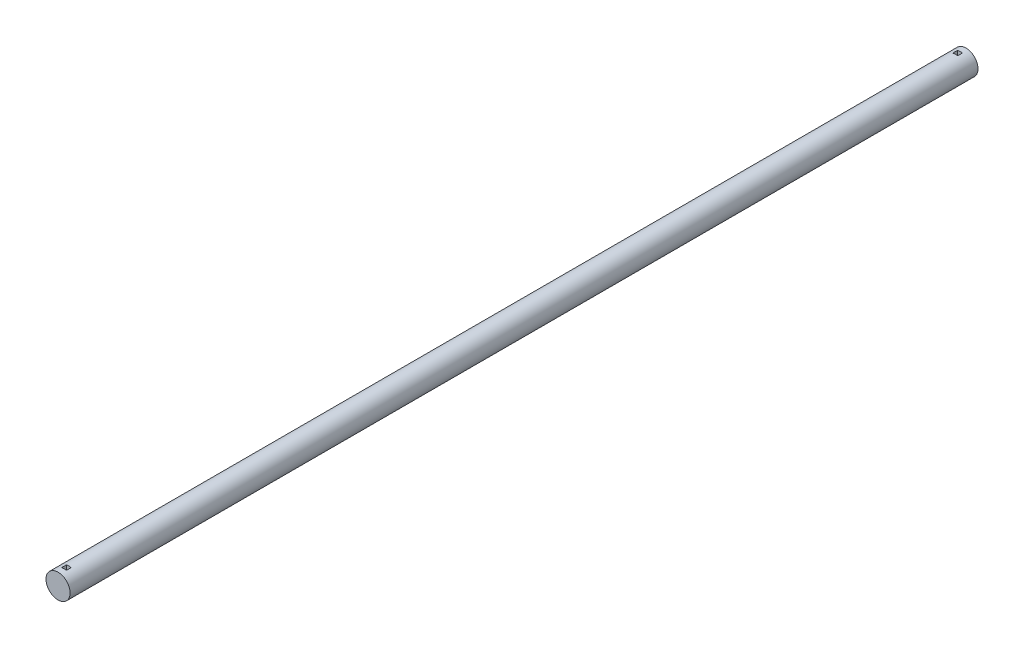
ISO-10303-21;
HEADER;
FILE_DESCRIPTION(('STEP AP214'),'2;1');
FILE_NAME('part.step','',(''),(''),'','','');
FILE_SCHEMA(('AUTOMOTIVE_DESIGN { 1 0 10303 214 1 1 1 1 }'));
ENDSEC;
DATA;
#1=APPLICATION_CONTEXT('core data for automotive mechanical design processes');
#2=APPLICATION_PROTOCOL_DEFINITION('international standard','automotive_design',2000,#1);
#3=PRODUCT_CONTEXT('',#1,'mechanical');
#4=PRODUCT('Part','Part','',(#3));
#5=PRODUCT_RELATED_PRODUCT_CATEGORY('part','',(#4));
#6=PRODUCT_DEFINITION_FORMATION('','',#4);
#7=PRODUCT_DEFINITION_CONTEXT('part definition',#1,'design');
#8=PRODUCT_DEFINITION('design','',#6,#7);
#9=PRODUCT_DEFINITION_SHAPE('','',#8);
#10=(LENGTH_UNIT() NAMED_UNIT(*) SI_UNIT(.MILLI.,.METRE.));
#11=(NAMED_UNIT(*) PLANE_ANGLE_UNIT() SI_UNIT($,.RADIAN.));
#12=(NAMED_UNIT(*) SI_UNIT($,.STERADIAN.) SOLID_ANGLE_UNIT());
#13=UNCERTAINTY_MEASURE_WITH_UNIT(LENGTH_MEASURE(1.E-05),#10,'distance_accuracy_value','');
#14=(GEOMETRIC_REPRESENTATION_CONTEXT(3) GLOBAL_UNCERTAINTY_ASSIGNED_CONTEXT((#13)) GLOBAL_UNIT_ASSIGNED_CONTEXT((#10,
#11,#12)) REPRESENTATION_CONTEXT('',''));
#15=CARTESIAN_POINT('',(0.,0.,0.));
#16=DIRECTION('',(0.,0.,1.));
#17=DIRECTION('',(1.,0.,0.));
#18=AXIS2_PLACEMENT_3D('',#15,#16,#17);
#19=CARTESIAN_POINT('',(0.,0.,3800.));
#20=DIRECTION('',(0.,0.,-1.));
#21=DIRECTION('',(-1.,0.,0.));
#22=AXIS2_PLACEMENT_3D('',#19,#20,#21);
#23=CYLINDRICAL_SURFACE('',#22,50.5);
#24=DIRECTION('',(0.,0.,-1.));
#25=VECTOR('',#24,1.);
#26=CARTESIAN_POINT('',(-10.,-49.5,3800.));
#27=LINE('',#26,#25);
#28=CARTESIAN_POINT('',(-10.,-49.5,24.9999999999999));
#29=VERTEX_POINT('',#28);
#30=CARTESIAN_POINT('',(-10.,-49.5,44.9999999999999));
#31=VERTEX_POINT('',#30);
#32=EDGE_CURVE('E176',#29,#31,#27,.F.);
#33=ORIENTED_EDGE('',*,*,#32,.T.);
#34=CARTESIAN_POINT('',(0.,0.,44.9999999999999));
#35=DIRECTION('',(0.,0.,1.));
#36=DIRECTION('',(1.,0.,0.));
#37=AXIS2_PLACEMENT_3D('',#34,#35,#36);
#38=CIRCLE('',#37,50.5);
#39=CARTESIAN_POINT('',(10.,-49.5,44.9999999999999));
#40=VERTEX_POINT('',#39);
#41=EDGE_CURVE('E159',#31,#40,#38,.T.);
#42=ORIENTED_EDGE('',*,*,#41,.T.);
#43=DIRECTION('',(0.,0.,-1.));
#44=VECTOR('',#43,1.);
#45=CARTESIAN_POINT('',(10.0000000000007,-49.4999999999999,3800.));
#46=LINE('',#45,#44);
#47=CARTESIAN_POINT('',(10.,-49.4999999999999,25.));
#48=VERTEX_POINT('',#47);
#49=EDGE_CURVE('E172',#40,#48,#46,.T.);
#50=ORIENTED_EDGE('',*,*,#49,.T.);
#51=CARTESIAN_POINT('',(0.,0.,24.9999999999999));
#52=DIRECTION('',(0.,0.,-1.));
#53=DIRECTION('',(-1.,0.,0.));
#54=AXIS2_PLACEMENT_3D('',#51,#52,#53);
#55=CIRCLE('',#54,50.5);
#56=EDGE_CURVE('E164',#48,#29,#55,.T.);
#57=ORIENTED_EDGE('',*,*,#56,.T.);
#58=EDGE_LOOP('',(#33,#42,#50,#57));
#59=FACE_BOUND('',#58,.T.);
#60=DIRECTION('',(0.,0.,-1.));
#61=VECTOR('',#60,1.);
#62=CARTESIAN_POINT('',(10.0000000000007,49.4999999999999,3800.));
#63=LINE('',#62,#61);
#64=CARTESIAN_POINT('',(10.,49.4999999999999,25.));
#65=VERTEX_POINT('',#64);
#66=CARTESIAN_POINT('',(10.,49.5,44.9999999999999));
#67=VERTEX_POINT('',#66);
#68=EDGE_CURVE('E168',#65,#67,#63,.F.);
#69=ORIENTED_EDGE('',*,*,#68,.T.);
#70=CARTESIAN_POINT('',(-10.,49.5,44.9999999999999));
#71=VERTEX_POINT('',#70);
#72=EDGE_CURVE('E151',#67,#71,#38,.T.);
#73=ORIENTED_EDGE('',*,*,#72,.T.);
#74=DIRECTION('',(0.,0.,-1.));
#75=VECTOR('',#74,1.);
#76=CARTESIAN_POINT('',(-10.,49.5,3800.));
#77=LINE('',#76,#75);
#78=CARTESIAN_POINT('',(-10.,49.5,24.9999999999999));
#79=VERTEX_POINT('',#78);
#80=EDGE_CURVE('E163',#71,#79,#77,.T.);
#81=ORIENTED_EDGE('',*,*,#80,.T.);
#82=EDGE_CURVE('E158',#79,#65,#55,.T.);
#83=ORIENTED_EDGE('',*,*,#82,.T.);
#84=EDGE_LOOP('',(#69,#73,#81,#83));
#85=FACE_BOUND('',#84,.T.);
#86=CARTESIAN_POINT('',(0.,0.,3800.));
#87=DIRECTION('',(0.,0.,1.));
#88=DIRECTION('',(1.,0.,0.));
#89=AXIS2_PLACEMENT_3D('',#86,#87,#88);
#90=CIRCLE('',#89,50.5);
#91=CARTESIAN_POINT('',(50.5,0.,3800.));
#92=VERTEX_POINT('',#91);
#93=EDGE_CURVE('E147',#92,#92,#90,.T.);
#94=ORIENTED_EDGE('',*,*,#93,.F.);
#95=EDGE_LOOP('',(#94));
#96=FACE_BOUND('',#95,.T.);
#97=CARTESIAN_POINT('',(0.,0.,0.));
#98=DIRECTION('',(0.,0.,1.));
#99=DIRECTION('',(1.,0.,0.));
#100=AXIS2_PLACEMENT_3D('',#97,#98,#99);
#101=CIRCLE('',#100,50.5);
#102=CARTESIAN_POINT('',(50.5,0.,0.));
#103=VERTEX_POINT('',#102);
#104=EDGE_CURVE('E138',#103,#103,#101,.T.);
#105=ORIENTED_EDGE('',*,*,#104,.T.);
#106=EDGE_LOOP('',(#105));
#107=FACE_BOUND('',#106,.T.);
#108=CARTESIAN_POINT('',(0.,0.,3775.));
#109=DIRECTION('',(0.,0.,-1.));
#110=DIRECTION('',(-1.,0.,0.));
#111=AXIS2_PLACEMENT_3D('',#108,#109,#110);
#112=CIRCLE('',#111,50.5);
#113=CARTESIAN_POINT('',(-10.,49.5,3775.));
#114=VERTEX_POINT('',#113);
#115=CARTESIAN_POINT('',(10.,49.5,3775.));
#116=VERTEX_POINT('',#115);
#117=EDGE_CURVE('E113',#114,#116,#112,.T.);
#118=ORIENTED_EDGE('',*,*,#117,.F.);
#119=DIRECTION('',(0.,0.,-1.));
#120=VECTOR('',#119,1.);
#121=CARTESIAN_POINT('',(-10.,49.5,3800.));
#122=LINE('',#121,#120);
#123=CARTESIAN_POINT('',(-10.,49.5,3755.));
#124=VERTEX_POINT('',#123);
#125=EDGE_CURVE('E111',#124,#114,#122,.F.);
#126=ORIENTED_EDGE('',*,*,#125,.F.);
#127=CARTESIAN_POINT('',(0.,0.,3755.));
#128=DIRECTION('',(0.,0.,1.));
#129=DIRECTION('',(1.,0.,0.));
#130=AXIS2_PLACEMENT_3D('',#127,#128,#129);
#131=CIRCLE('',#130,50.5);
#132=CARTESIAN_POINT('',(10.,49.5,3755.));
#133=VERTEX_POINT('',#132);
#134=EDGE_CURVE('E184',#133,#124,#131,.T.);
#135=ORIENTED_EDGE('',*,*,#134,.F.);
#136=DIRECTION('',(0.,0.,-1.));
#137=VECTOR('',#136,1.);
#138=CARTESIAN_POINT('',(10.,49.5,3800.));
#139=LINE('',#138,#137);
#140=EDGE_CURVE('E181',#116,#133,#139,.T.);
#141=ORIENTED_EDGE('',*,*,#140,.F.);
#142=EDGE_LOOP('',(#118,#126,#135,#141));
#143=FACE_BOUND('',#142,.T.);
#144=CARTESIAN_POINT('',(10.,-49.5,3775.));
#145=VERTEX_POINT('',#144);
#146=CARTESIAN_POINT('',(-10.,-49.5,3775.));
#147=VERTEX_POINT('',#146);
#148=EDGE_CURVE('E103',#145,#147,#112,.T.);
#149=ORIENTED_EDGE('',*,*,#148,.F.);
#150=DIRECTION('',(0.,0.,-1.));
#151=VECTOR('',#150,1.);
#152=CARTESIAN_POINT('',(10.,-49.5,3800.));
#153=LINE('',#152,#151);
#154=CARTESIAN_POINT('',(10.,-49.5,3755.));
#155=VERTEX_POINT('',#154);
#156=EDGE_CURVE('E11',#155,#145,#153,.F.);
#157=ORIENTED_EDGE('',*,*,#156,.F.);
#158=CARTESIAN_POINT('',(-10.,-49.5,3755.));
#159=VERTEX_POINT('',#158);
#160=EDGE_CURVE('E110',#159,#155,#131,.T.);
#161=ORIENTED_EDGE('',*,*,#160,.F.);
#162=DIRECTION('',(0.,0.,-1.));
#163=VECTOR('',#162,1.);
#164=CARTESIAN_POINT('',(-10.,-49.5,3800.));
#165=LINE('',#164,#163);
#166=EDGE_CURVE('E47',#147,#159,#165,.T.);
#167=ORIENTED_EDGE('',*,*,#166,.F.);
#168=EDGE_LOOP('',(#149,#157,#161,#167));
#169=FACE_BOUND('',#168,.T.);
#170=ADVANCED_FACE('F39',(#59,#85,#96,#107,#143,#169),#23,.T.);
#171=CARTESIAN_POINT('',(0.,0.,3800.));
#172=DIRECTION('',(0.,0.,1.));
#173=DIRECTION('',(1.,0.,0.));
#174=AXIS2_PLACEMENT_3D('',#171,#172,#173);
#175=PLANE('',#174);
#176=ORIENTED_EDGE('',*,*,#93,.T.);
#177=EDGE_LOOP('',(#176));
#178=FACE_BOUND('',#177,.T.);
#179=ADVANCED_FACE('F221',(#178),#175,.T.);
#180=CARTESIAN_POINT('',(0.,0.,0.));
#181=DIRECTION('',(0.,0.,1.));
#182=DIRECTION('',(1.,0.,0.));
#183=AXIS2_PLACEMENT_3D('',#180,#181,#182);
#184=PLANE('',#183);
#185=ORIENTED_EDGE('',*,*,#104,.F.);
#186=EDGE_LOOP('',(#185));
#187=FACE_BOUND('',#186,.T.);
#188=ADVANCED_FACE('F214',(#187),#184,.F.);
#189=CARTESIAN_POINT('',(-10.,-50.5,25.));
#190=DIRECTION('',(-1.,0.,0.));
#191=DIRECTION('',(0.,0.,1.));
#192=AXIS2_PLACEMENT_3D('',#189,#190,#191);
#193=PLANE('',#192);
#194=DIRECTION('',(0.,1.,0.));
#195=VECTOR('',#194,1.);
#196=CARTESIAN_POINT('',(-10.,-50.5,45.));
#197=LINE('',#196,#195);
#198=EDGE_CURVE('E59',#31,#71,#197,.T.);
#199=ORIENTED_EDGE('',*,*,#198,.F.);
#200=ORIENTED_EDGE('',*,*,#32,.F.);
#201=DIRECTION('',(0.,1.,0.));
#202=VECTOR('',#201,1.);
#203=CARTESIAN_POINT('',(-10.,-50.5,25.));
#204=LINE('',#203,#202);
#205=EDGE_CURVE('E134',#29,#79,#204,.T.);
#206=ORIENTED_EDGE('',*,*,#205,.T.);
#207=ORIENTED_EDGE('',*,*,#80,.F.);
#208=EDGE_LOOP('',(#199,#200,#206,#207));
#209=FACE_BOUND('',#208,.T.);
#210=ADVANCED_FACE('F212',(#209),#193,.F.);
#211=CARTESIAN_POINT('',(-10.,-50.5,25.));
#212=DIRECTION('',(0.,0.,-1.));
#213=DIRECTION('',(-1.,0.,0.));
#214=AXIS2_PLACEMENT_3D('',#211,#212,#213);
#215=PLANE('',#214);
#216=ORIENTED_EDGE('',*,*,#205,.F.);
#217=ORIENTED_EDGE('',*,*,#56,.F.);
#218=DIRECTION('',(0.,1.,0.));
#219=VECTOR('',#218,1.);
#220=CARTESIAN_POINT('',(10.,-50.5,25.));
#221=LINE('',#220,#219);
#222=EDGE_CURVE('E139',#48,#65,#221,.T.);
#223=ORIENTED_EDGE('',*,*,#222,.T.);
#224=ORIENTED_EDGE('',*,*,#82,.F.);
#225=EDGE_LOOP('',(#216,#217,#223,#224));
#226=FACE_BOUND('',#225,.T.);
#227=ADVANCED_FACE('F207',(#226),#215,.F.);
#228=CARTESIAN_POINT('',(10.,-50.5,25.));
#229=DIRECTION('',(1.,0.,0.));
#230=DIRECTION('',(0.,0.,-1.));
#231=AXIS2_PLACEMENT_3D('',#228,#229,#230);
#232=PLANE('',#231);
#233=DIRECTION('',(0.,1.,0.));
#234=VECTOR('',#233,1.);
#235=CARTESIAN_POINT('',(10.,-50.5,45.));
#236=LINE('',#235,#234);
#237=EDGE_CURVE('E54',#40,#67,#236,.T.);
#238=ORIENTED_EDGE('',*,*,#237,.T.);
#239=ORIENTED_EDGE('',*,*,#68,.F.);
#240=ORIENTED_EDGE('',*,*,#222,.F.);
#241=ORIENTED_EDGE('',*,*,#49,.F.);
#242=EDGE_LOOP('',(#238,#239,#240,#241));
#243=FACE_BOUND('',#242,.T.);
#244=ADVANCED_FACE('F209',(#243),#232,.F.);
#245=CARTESIAN_POINT('',(-10.,-50.5,45.));
#246=DIRECTION('',(0.,0.,1.));
#247=DIRECTION('',(1.,0.,0.));
#248=AXIS2_PLACEMENT_3D('',#245,#246,#247);
#249=PLANE('',#248);
#250=ORIENTED_EDGE('',*,*,#237,.F.);
#251=ORIENTED_EDGE('',*,*,#41,.F.);
#252=ORIENTED_EDGE('',*,*,#198,.T.);
#253=ORIENTED_EDGE('',*,*,#72,.F.);
#254=EDGE_LOOP('',(#250,#251,#252,#253));
#255=FACE_BOUND('',#254,.T.);
#256=ADVANCED_FACE('F238',(#255),#249,.F.);
#257=CARTESIAN_POINT('',(-10.,-50.5,3775.));
#258=DIRECTION('',(1.,0.,0.));
#259=DIRECTION('',(0.,0.,-1.));
#260=AXIS2_PLACEMENT_3D('',#257,#258,#259);
#261=PLANE('',#260);
#262=ORIENTED_EDGE('',*,*,#166,.T.);
#263=DIRECTION('',(0.,1.,0.));
#264=VECTOR('',#263,1.);
#265=CARTESIAN_POINT('',(-10.,-50.5,3755.));
#266=LINE('',#265,#264);
#267=EDGE_CURVE('E129',#159,#124,#266,.T.);
#268=ORIENTED_EDGE('',*,*,#267,.T.);
#269=ORIENTED_EDGE('',*,*,#125,.T.);
#270=DIRECTION('',(0.,1.,0.));
#271=VECTOR('',#270,1.);
#272=CARTESIAN_POINT('',(-10.,-50.5,3775.));
#273=LINE('',#272,#271);
#274=EDGE_CURVE('E125',#147,#114,#273,.T.);
#275=ORIENTED_EDGE('',*,*,#274,.F.);
#276=EDGE_LOOP('',(#262,#268,#269,#275));
#277=FACE_BOUND('',#276,.T.);
#278=ADVANCED_FACE('F236',(#277),#261,.T.);
#279=CARTESIAN_POINT('',(-10.,-50.5,3755.));
#280=DIRECTION('',(0.,0.,1.));
#281=DIRECTION('',(1.,0.,0.));
#282=AXIS2_PLACEMENT_3D('',#279,#280,#281);
#283=PLANE('',#282);
#284=DIRECTION('',(0.,1.,0.));
#285=VECTOR('',#284,1.);
#286=CARTESIAN_POINT('',(10.,-50.5,3755.));
#287=LINE('',#286,#285);
#288=EDGE_CURVE('E122',#155,#133,#287,.T.);
#289=ORIENTED_EDGE('',*,*,#288,.T.);
#290=ORIENTED_EDGE('',*,*,#134,.T.);
#291=ORIENTED_EDGE('',*,*,#267,.F.);
#292=ORIENTED_EDGE('',*,*,#160,.T.);
#293=EDGE_LOOP('',(#289,#290,#291,#292));
#294=FACE_BOUND('',#293,.T.);
#295=ADVANCED_FACE('F195',(#294),#283,.T.);
#296=CARTESIAN_POINT('',(10.,-50.5,3775.));
#297=DIRECTION('',(-1.,0.,0.));
#298=DIRECTION('',(0.,0.,1.));
#299=AXIS2_PLACEMENT_3D('',#296,#297,#298);
#300=PLANE('',#299);
#301=ORIENTED_EDGE('',*,*,#140,.T.);
#302=ORIENTED_EDGE('',*,*,#288,.F.);
#303=ORIENTED_EDGE('',*,*,#156,.T.);
#304=DIRECTION('',(0.,1.,0.));
#305=VECTOR('',#304,1.);
#306=CARTESIAN_POINT('',(10.,-50.5,3775.));
#307=LINE('',#306,#305);
#308=EDGE_CURVE('E119',#145,#116,#307,.T.);
#309=ORIENTED_EDGE('',*,*,#308,.T.);
#310=EDGE_LOOP('',(#301,#302,#303,#309));
#311=FACE_BOUND('',#310,.T.);
#312=ADVANCED_FACE('F118',(#311),#300,.T.);
#313=CARTESIAN_POINT('',(-10.,-50.5,3775.));
#314=DIRECTION('',(0.,0.,-1.));
#315=DIRECTION('',(-1.,0.,0.));
#316=AXIS2_PLACEMENT_3D('',#313,#314,#315);
#317=PLANE('',#316);
#318=ORIENTED_EDGE('',*,*,#274,.T.);
#319=ORIENTED_EDGE('',*,*,#117,.T.);
#320=ORIENTED_EDGE('',*,*,#308,.F.);
#321=ORIENTED_EDGE('',*,*,#148,.T.);
#322=EDGE_LOOP('',(#318,#319,#320,#321));
#323=FACE_BOUND('',#322,.T.);
#324=ADVANCED_FACE('F123',(#323),#317,.T.);
#325=CLOSED_SHELL('',(#170,#179,#188,#210,#227,#244,#256,#278,#295,#312,#324));
#326=MANIFOLD_SOLID_BREP('B2',#325);
#327=ADVANCED_BREP_SHAPE_REPRESENTATION('',(#18,#326),#14);
#328=SHAPE_DEFINITION_REPRESENTATION(#9,#327);
ENDSEC;
END-ISO-10303-21;
